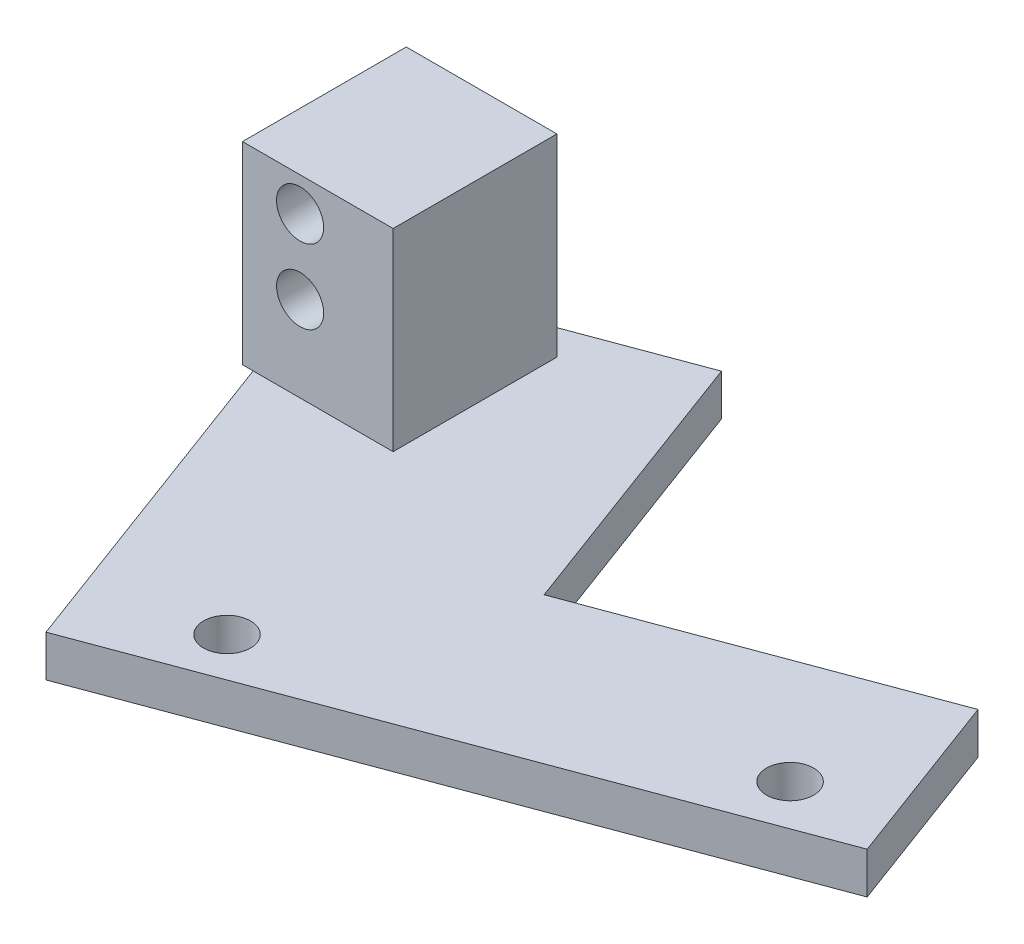
ISO-10303-21;
HEADER;
FILE_DESCRIPTION(('STEP AP214'),'2;1');
FILE_NAME('part.step','',(''),(''),'','','');
FILE_SCHEMA(('AUTOMOTIVE_DESIGN { 1 0 10303 214 1 1 1 1 }'));
ENDSEC;
DATA;
#1=APPLICATION_CONTEXT('core data for automotive mechanical design processes');
#2=APPLICATION_PROTOCOL_DEFINITION('international standard','automotive_design',2000,#1);
#3=PRODUCT_CONTEXT('',#1,'mechanical');
#4=PRODUCT('Part','Part','',(#3));
#5=PRODUCT_RELATED_PRODUCT_CATEGORY('part','',(#4));
#6=PRODUCT_DEFINITION_FORMATION('','',#4);
#7=PRODUCT_DEFINITION_CONTEXT('part definition',#1,'design');
#8=PRODUCT_DEFINITION('design','',#6,#7);
#9=PRODUCT_DEFINITION_SHAPE('','',#8);
#10=(LENGTH_UNIT() NAMED_UNIT(*) SI_UNIT(.MILLI.,.METRE.));
#11=(NAMED_UNIT(*) PLANE_ANGLE_UNIT() SI_UNIT($,.RADIAN.));
#12=(NAMED_UNIT(*) SI_UNIT($,.STERADIAN.) SOLID_ANGLE_UNIT());
#13=UNCERTAINTY_MEASURE_WITH_UNIT(LENGTH_MEASURE(1.E-05),#10,'distance_accuracy_value','');
#14=(GEOMETRIC_REPRESENTATION_CONTEXT(3) GLOBAL_UNCERTAINTY_ASSIGNED_CONTEXT((#13)) GLOBAL_UNIT_ASSIGNED_CONTEXT((#10,
#11,#12)) REPRESENTATION_CONTEXT('',''));
#15=CARTESIAN_POINT('',(0.,0.,0.));
#16=DIRECTION('',(0.,0.,1.));
#17=DIRECTION('',(1.,0.,0.));
#18=AXIS2_PLACEMENT_3D('',#15,#16,#17);
#19=CARTESIAN_POINT('',(-91.4998945327473,102.490000374125,55.16093843316));
#20=DIRECTION('',(0.,1.,0.));
#21=DIRECTION('',(-1.,0.,0.));
#22=AXIS2_PLACEMENT_3D('',#19,#20,#21);
#23=PLANE('',#22);
#24=DIRECTION('',(0.,0.,-1.));
#25=VECTOR('',#24,1.);
#26=CARTESIAN_POINT('',(-111.819894532747,102.490000374125,55.16093843316));
#27=LINE('',#26,#25);
#28=CARTESIAN_POINT('',(-111.819894532747,102.490000374125,22.0979999999999));
#29=VERTEX_POINT('',#28);
#30=CARTESIAN_POINT('',(-111.819894532747,102.490000374125,18.2301481765038));
#31=VERTEX_POINT('',#30);
#32=EDGE_CURVE('E98',#29,#31,#27,.T.);
#33=ORIENTED_EDGE('',*,*,#32,.T.);
#34=DIRECTION('',(0.348563605767916,0.,0.937285128834374));
#35=VECTOR('',#34,1.);
#36=CARTESIAN_POINT('',(-116.851792660847,102.490000374125,4.69940885882034));
#37=LINE('',#36,#35);
#38=CARTESIAN_POINT('',(-110.381492986944,102.490000374125,22.098));
#39=VERTEX_POINT('',#38);
#40=EDGE_CURVE('E11',#31,#39,#37,.T.);
#41=ORIENTED_EDGE('',*,*,#40,.T.);
#42=DIRECTION('',(-1.,0.,0.));
#43=VECTOR('',#42,1.);
#44=CARTESIAN_POINT('',(-91.4998945327473,102.490000374125,22.0979999999999));
#45=LINE('',#44,#43);
#46=EDGE_CURVE('E66',#39,#29,#45,.T.);
#47=ORIENTED_EDGE('',*,*,#46,.T.);
#48=EDGE_LOOP('',(#33,#41,#47));
#49=FACE_BOUND('',#48,.T.);
#50=ADVANCED_FACE('F39',(#49),#23,.F.);
#51=CARTESIAN_POINT('',(0.,0.,0.));
#52=DIRECTION('',(0.,0.,-1.));
#53=DIRECTION('',(-1.,0.,0.));
#54=AXIS2_PLACEMENT_3D('',#51,#52,#53);
#55=PLANE('',#54);
#56=CARTESIAN_POINT('',(-104.050470740245,123.999999999999,0.));
#57=DIRECTION('',(0.,0.,1.));
#58=DIRECTION('',(1.,0.,0.));
#59=AXIS2_PLACEMENT_3D('',#56,#57,#58);
#60=CIRCLE('',#59,3.17499999999998);
#61=CARTESIAN_POINT('',(-100.875470740245,123.999999999999,0.));
#62=VERTEX_POINT('',#61);
#63=EDGE_CURVE('E123',#62,#62,#60,.T.);
#64=ORIENTED_EDGE('',*,*,#63,.T.);
#65=EDGE_LOOP('',(#64));
#66=FACE_BOUND('',#65,.T.);
#67=DIRECTION('',(0.,-1.,0.));
#68=VECTOR('',#67,1.);
#69=CARTESIAN_POINT('',(-111.819894532747,102.490000374125,0.));
#70=LINE('',#69,#68);
#71=CARTESIAN_POINT('',(-111.819894532747,128.571708482202,0.));
#72=VERTEX_POINT('',#71);
#73=CARTESIAN_POINT('',(-111.819894532747,102.490000374125,0.));
#74=VERTEX_POINT('',#73);
#75=EDGE_CURVE('E105',#72,#74,#70,.T.);
#76=ORIENTED_EDGE('',*,*,#75,.F.);
#77=DIRECTION('',(-1.,0.,0.));
#78=VECTOR('',#77,1.);
#79=CARTESIAN_POINT('',(-111.819894532747,128.571708482202,0.));
#80=LINE('',#79,#78);
#81=CARTESIAN_POINT('',(-91.4998945327473,128.571708482202,0.));
#82=VERTEX_POINT('',#81);
#83=EDGE_CURVE('E135',#82,#72,#80,.T.);
#84=ORIENTED_EDGE('',*,*,#83,.F.);
#85=DIRECTION('',(0.,1.,0.));
#86=VECTOR('',#85,1.);
#87=CARTESIAN_POINT('',(-91.4998945327473,128.571708482202,0.));
#88=LINE('',#87,#86);
#89=CARTESIAN_POINT('',(-91.4998945327473,102.490000374125,0.));
#90=VERTEX_POINT('',#89);
#91=EDGE_CURVE('E133',#90,#82,#88,.T.);
#92=ORIENTED_EDGE('',*,*,#91,.F.);
#93=DIRECTION('',(1.,0.,0.));
#94=VECTOR('',#93,1.);
#95=CARTESIAN_POINT('',(-91.4998945327473,102.490000374125,0.));
#96=LINE('',#95,#94);
#97=CARTESIAN_POINT('',(-104.215114692185,102.490000374125,0.));
#98=VERTEX_POINT('',#97);
#99=EDGE_CURVE('E108',#98,#90,#96,.T.);
#100=ORIENTED_EDGE('',*,*,#99,.F.);
#101=EDGE_CURVE('E91',#74,#98,#96,.T.);
#102=ORIENTED_EDGE('',*,*,#101,.F.);
#103=EDGE_LOOP('',(#76,#84,#92,#100,#102));
#104=FACE_BOUND('',#103,.T.);
#105=CARTESIAN_POINT('',(-104.045206420171,113.999999999999,0.));
#106=DIRECTION('',(0.,0.,1.));
#107=DIRECTION('',(1.,0.,0.));
#108=AXIS2_PLACEMENT_3D('',#105,#106,#107);
#109=CIRCLE('',#108,3.17499999999995);
#110=CARTESIAN_POINT('',(-100.870206420171,113.999999999999,0.));
#111=VERTEX_POINT('',#110);
#112=EDGE_CURVE('E126',#111,#111,#109,.T.);
#113=ORIENTED_EDGE('',*,*,#112,.T.);
#114=EDGE_LOOP('',(#113));
#115=FACE_BOUND('',#114,.T.);
#116=ADVANCED_FACE('F102',(#66,#104,#115),#55,.T.);
#117=CARTESIAN_POINT('',(-111.819894532747,102.490000374125,55.16093843316));
#118=DIRECTION('',(1.,0.,0.));
#119=DIRECTION('',(0.,0.,-1.));
#120=AXIS2_PLACEMENT_3D('',#117,#118,#119);
#121=PLANE('',#120);
#122=ORIENTED_EDGE('',*,*,#32,.F.);
#123=DIRECTION('',(0.,1.,0.));
#124=VECTOR('',#123,1.);
#125=CARTESIAN_POINT('',(-111.819894532747,102.490000374125,22.0979999999999));
#126=LINE('',#125,#124);
#127=CARTESIAN_POINT('',(-111.819894532747,128.571708482202,22.0979999999999));
#128=VERTEX_POINT('',#127);
#129=EDGE_CURVE('E119',#29,#128,#126,.T.);
#130=ORIENTED_EDGE('',*,*,#129,.T.);
#131=DIRECTION('',(0.,0.,-1.));
#132=VECTOR('',#131,1.);
#133=CARTESIAN_POINT('',(-111.819894532747,128.571708482202,55.16093843316));
#134=LINE('',#133,#132);
#135=EDGE_CURVE('E115',#128,#72,#134,.T.);
#136=ORIENTED_EDGE('',*,*,#135,.T.);
#137=ORIENTED_EDGE('',*,*,#75,.T.);
#138=CARTESIAN_POINT('',(-111.819894532747,102.490000374125,2.82811430668283));
#139=VERTEX_POINT('',#138);
#140=EDGE_CURVE('E87',#139,#74,#27,.T.);
#141=ORIENTED_EDGE('',*,*,#140,.F.);
#142=EDGE_CURVE('E95',#31,#139,#27,.T.);
#143=ORIENTED_EDGE('',*,*,#142,.F.);
#144=EDGE_LOOP('',(#122,#130,#136,#137,#141,#143));
#145=FACE_BOUND('',#144,.T.);
#146=ADVANCED_FACE('F112',(#145),#121,.F.);
#147=ORIENTED_EDGE('',*,*,#101,.T.);
#148=DIRECTION('',(-0.937285128834374,0.,0.348563605767916));
#149=VECTOR('',#148,1.);
#150=CARTESIAN_POINT('',(-116.851792660847,102.490000374125,4.69940885882034));
#151=LINE('',#150,#149);
#152=EDGE_CURVE('E48',#98,#139,#151,.T.);
#153=ORIENTED_EDGE('',*,*,#152,.T.);
#154=ORIENTED_EDGE('',*,*,#140,.T.);
#155=EDGE_LOOP('',(#147,#153,#154));
#156=FACE_BOUND('',#155,.T.);
#157=ADVANCED_FACE('F89',(#156),#23,.F.);
#158=CARTESIAN_POINT('',(-91.4998945327473,128.571708482202,55.16093843316));
#159=DIRECTION('',(-1.,0.,0.));
#160=DIRECTION('',(0.,0.,1.));
#161=AXIS2_PLACEMENT_3D('',#158,#159,#160);
#162=PLANE('',#161);
#163=DIRECTION('',(0.,0.,-1.));
#164=VECTOR('',#163,1.);
#165=CARTESIAN_POINT('',(-91.4998945327473,128.571708482202,55.16093843316));
#166=LINE('',#165,#164);
#167=CARTESIAN_POINT('',(-91.4998945327473,128.571708482202,22.0979999999999));
#168=VERTEX_POINT('',#167);
#169=EDGE_CURVE('E134',#168,#82,#166,.T.);
#170=ORIENTED_EDGE('',*,*,#169,.F.);
#171=DIRECTION('',(0.,-1.,0.));
#172=VECTOR('',#171,1.);
#173=CARTESIAN_POINT('',(-91.4998945327473,128.571708482202,22.0979999999999));
#174=LINE('',#173,#172);
#175=CARTESIAN_POINT('',(-91.4998945327473,102.490000374125,22.0979999999999));
#176=VERTEX_POINT('',#175);
#177=EDGE_CURVE('E109',#168,#176,#174,.T.);
#178=ORIENTED_EDGE('',*,*,#177,.T.);
#179=DIRECTION('',(0.,0.,-1.));
#180=VECTOR('',#179,1.);
#181=CARTESIAN_POINT('',(-91.4998945327473,102.490000374125,55.16093843316));
#182=LINE('',#181,#180);
#183=EDGE_CURVE('E130',#176,#90,#182,.T.);
#184=ORIENTED_EDGE('',*,*,#183,.T.);
#185=ORIENTED_EDGE('',*,*,#91,.T.);
#186=EDGE_LOOP('',(#170,#178,#184,#185));
#187=FACE_BOUND('',#186,.T.);
#188=ADVANCED_FACE('F160',(#187),#162,.F.);
#189=CARTESIAN_POINT('',(-111.819894532747,128.571708482202,55.16093843316));
#190=DIRECTION('',(0.,-1.,0.));
#191=DIRECTION('',(0.,0.,-1.));
#192=AXIS2_PLACEMENT_3D('',#189,#190,#191);
#193=PLANE('',#192);
#194=ORIENTED_EDGE('',*,*,#135,.F.);
#195=DIRECTION('',(1.,0.,0.));
#196=VECTOR('',#195,1.);
#197=CARTESIAN_POINT('',(-111.819894532747,128.571708482202,22.0979999999999));
#198=LINE('',#197,#196);
#199=EDGE_CURVE('E136',#128,#168,#198,.T.);
#200=ORIENTED_EDGE('',*,*,#199,.T.);
#201=ORIENTED_EDGE('',*,*,#169,.T.);
#202=ORIENTED_EDGE('',*,*,#83,.T.);
#203=EDGE_LOOP('',(#194,#200,#201,#202));
#204=FACE_BOUND('',#203,.T.);
#205=ADVANCED_FACE('F318',(#204),#193,.F.);
#206=CARTESIAN_POINT('',(-104.050470740245,123.999999999999,55.16093843316));
#207=DIRECTION('',(0.,0.,-1.));
#208=DIRECTION('',(-1.,0.,0.));
#209=AXIS2_PLACEMENT_3D('',#206,#207,#208);
#210=CYLINDRICAL_SURFACE('',#209,3.17499999999998);
#211=CARTESIAN_POINT('',(-104.050470740245,123.999999999999,22.0979999999999));
#212=DIRECTION('',(0.,0.,-1.));
#213=DIRECTION('',(-1.,0.,0.));
#214=AXIS2_PLACEMENT_3D('',#211,#212,#213);
#215=CIRCLE('',#214,3.17499999999998);
#216=CARTESIAN_POINT('',(-107.225470740245,123.999999999999,22.0979999999999));
#217=VERTEX_POINT('',#216);
#218=EDGE_CURVE('E143',#217,#217,#215,.T.);
#219=ORIENTED_EDGE('',*,*,#218,.F.);
#220=EDGE_LOOP('',(#219));
#221=FACE_BOUND('',#220,.T.);
#222=ORIENTED_EDGE('',*,*,#63,.F.);
#223=EDGE_LOOP('',(#222));
#224=FACE_BOUND('',#223,.T.);
#225=ADVANCED_FACE('F322',(#221,#224),#210,.F.);
#226=CARTESIAN_POINT('',(-104.045206420171,113.999999999999,55.16093843316));
#227=DIRECTION('',(0.,0.,-1.));
#228=DIRECTION('',(-1.,0.,0.));
#229=AXIS2_PLACEMENT_3D('',#226,#227,#228);
#230=CYLINDRICAL_SURFACE('',#229,3.17499999999995);
#231=CARTESIAN_POINT('',(-104.045206420171,113.999999999999,22.0979999999999));
#232=DIRECTION('',(0.,0.,-1.));
#233=DIRECTION('',(-1.,0.,0.));
#234=AXIS2_PLACEMENT_3D('',#231,#232,#233);
#235=CIRCLE('',#234,3.17499999999995);
#236=CARTESIAN_POINT('',(-107.220206420171,113.999999999999,22.0979999999999));
#237=VERTEX_POINT('',#236);
#238=EDGE_CURVE('E43',#237,#237,#235,.T.);
#239=ORIENTED_EDGE('',*,*,#238,.F.);
#240=EDGE_LOOP('',(#239));
#241=FACE_BOUND('',#240,.T.);
#242=ORIENTED_EDGE('',*,*,#112,.F.);
#243=EDGE_LOOP('',(#242));
#244=FACE_BOUND('',#243,.T.);
#245=ADVANCED_FACE('F321',(#241,#244),#230,.F.);
#246=CARTESIAN_POINT('',(-135.790161013805,109.407487112952,22.0979999999999));
#247=DIRECTION('',(0.,0.,-1.));
#248=DIRECTION('',(-1.,0.,0.));
#249=AXIS2_PLACEMENT_3D('',#246,#247,#248);
#250=PLANE('',#249);
#251=ORIENTED_EDGE('',*,*,#238,.T.);
#252=EDGE_LOOP('',(#251));
#253=FACE_BOUND('',#252,.T.);
#254=ORIENTED_EDGE('',*,*,#218,.T.);
#255=EDGE_LOOP('',(#254));
#256=FACE_BOUND('',#255,.T.);
#257=EDGE_CURVE('E96',#176,#39,#45,.T.);
#258=ORIENTED_EDGE('',*,*,#257,.F.);
#259=ORIENTED_EDGE('',*,*,#177,.F.);
#260=ORIENTED_EDGE('',*,*,#199,.F.);
#261=ORIENTED_EDGE('',*,*,#129,.F.);
#262=ORIENTED_EDGE('',*,*,#46,.F.);
#263=EDGE_LOOP('',(#258,#259,#260,#261,#262));
#264=FACE_BOUND('',#263,.T.);
#265=ADVANCED_FACE('F41',(#253,#256,#264),#250,.F.);
#266=CARTESIAN_POINT('',(0.,102.490000374125,-1.55740159258012E-13));
#267=DIRECTION('',(0.,1.,0.));
#268=DIRECTION('',(0.,0.,1.));
#269=AXIS2_PLACEMENT_3D('',#266,#267,#268);
#270=PLANE('',#269);
#271=CARTESIAN_POINT('',(-116.851792660847,102.490000374125,4.69940885882034));
#272=VERTEX_POINT('',#271);
#273=EDGE_CURVE('E50',#272,#31,#37,.T.);
#274=ORIENTED_EDGE('',*,*,#273,.T.);
#275=ORIENTED_EDGE('',*,*,#142,.T.);
#276=EDGE_CURVE('E58',#139,#272,#151,.T.);
#277=ORIENTED_EDGE('',*,*,#276,.T.);
#278=EDGE_LOOP('',(#274,#275,#277));
#279=FACE_BOUND('',#278,.T.);
#280=ADVANCED_FACE('F294',(#279),#270,.T.);
#281=CARTESIAN_POINT('',(-116.851792660847,96.9020003741251,4.69940885882035));
#282=DIRECTION('',(-0.937285128834374,0.,0.348563605767916));
#283=DIRECTION('',(0.348563605767916,0.,0.937285128834374));
#284=AXIS2_PLACEMENT_3D('',#281,#282,#283);
#285=PLANE('',#284);
#286=ORIENTED_EDGE('',*,*,#273,.F.);
#287=DIRECTION('',(0.,1.,0.));
#288=VECTOR('',#287,1.);
#289=CARTESIAN_POINT('',(-116.851792660847,96.9020003741251,4.69940885882035));
#290=LINE('',#289,#288);
#291=CARTESIAN_POINT('',(-116.851792660847,96.9020003741251,4.69940885882035));
#292=VERTEX_POINT('',#291);
#293=EDGE_CURVE('E127',#292,#272,#290,.T.);
#294=ORIENTED_EDGE('',*,*,#293,.F.);
#295=DIRECTION('',(0.348563605767916,0.,0.937285128834374));
#296=VECTOR('',#295,1.);
#297=CARTESIAN_POINT('',(-116.851792660847,96.9020003741251,4.69940885882035));
#298=LINE('',#297,#296);
#299=CARTESIAN_POINT('',(-93.8326521359339,96.9020003741252,66.5977187670424));
#300=VERTEX_POINT('',#299);
#301=EDGE_CURVE('E226',#292,#300,#298,.T.);
#302=ORIENTED_EDGE('',*,*,#301,.T.);
#303=DIRECTION('',(0.,1.,0.));
#304=VECTOR('',#303,1.);
#305=CARTESIAN_POINT('',(-93.8326521359339,96.9020003741252,66.5977187670424));
#306=LINE('',#305,#304);
#307=CARTESIAN_POINT('',(-93.8326521359339,102.490000374125,66.5977187670424));
#308=VERTEX_POINT('',#307);
#309=EDGE_CURVE('E155',#300,#308,#306,.T.);
#310=ORIENTED_EDGE('',*,*,#309,.T.);
#311=EDGE_CURVE('E51',#39,#308,#37,.T.);
#312=ORIENTED_EDGE('',*,*,#311,.F.);
#313=ORIENTED_EDGE('',*,*,#40,.F.);
#314=EDGE_LOOP('',(#286,#294,#302,#310,#312,#313));
#315=FACE_BOUND('',#314,.T.);
#316=ADVANCED_FACE('F233',(#315),#285,.T.);
#317=CARTESIAN_POINT('',(-116.851792660847,96.9020003741251,4.69940885882035));
#318=DIRECTION('',(-0.348563605767916,0.,-0.937285128834374));
#319=DIRECTION('',(-0.937285128834374,0.,0.348563605767916));
#320=AXIS2_PLACEMENT_3D('',#317,#318,#319);
#321=PLANE('',#320);
#322=CARTESIAN_POINT('',(-78.7605250250181,102.490000374125,-9.46621607958777));
#323=VERTEX_POINT('',#322);
#324=EDGE_CURVE('E148',#323,#98,#151,.T.);
#325=ORIENTED_EDGE('',*,*,#324,.F.);
#326=DIRECTION('',(0.,1.,0.));
#327=VECTOR('',#326,1.);
#328=CARTESIAN_POINT('',(-78.7605250250181,96.9020003741251,-9.46621607958777));
#329=LINE('',#328,#327);
#330=CARTESIAN_POINT('',(-78.7605250250181,96.9020003741251,-9.46621607958777));
#331=VERTEX_POINT('',#330);
#332=EDGE_CURVE('E259',#331,#323,#329,.T.);
#333=ORIENTED_EDGE('',*,*,#332,.F.);
#334=DIRECTION('',(-0.937285128834374,0.,0.348563605767916));
#335=VECTOR('',#334,1.);
#336=CARTESIAN_POINT('',(-116.851792660847,96.9020003741251,4.69940885882035));
#337=LINE('',#336,#335);
#338=EDGE_CURVE('E220',#331,#292,#337,.T.);
#339=ORIENTED_EDGE('',*,*,#338,.T.);
#340=ORIENTED_EDGE('',*,*,#293,.T.);
#341=ORIENTED_EDGE('',*,*,#276,.F.);
#342=ORIENTED_EDGE('',*,*,#152,.F.);
#343=EDGE_LOOP('',(#325,#333,#339,#340,#341,#342));
#344=FACE_BOUND('',#343,.T.);
#345=ADVANCED_FACE('F340',(#344),#321,.T.);
#346=CARTESIAN_POINT('',(-78.7605250250181,96.9020003741251,-9.46621607958777));
#347=DIRECTION('',(0.937285128834374,0.,-0.348563605767916));
#348=DIRECTION('',(-0.348563605767916,0.,-0.937285128834374));
#349=AXIS2_PLACEMENT_3D('',#346,#347,#348);
#350=PLANE('',#349);
#351=DIRECTION('',(-0.348563605767916,0.,-0.937285128834374));
#352=VECTOR('',#351,1.);
#353=CARTESIAN_POINT('',(-78.7605250250181,102.490000374125,-9.46621607958777));
#354=LINE('',#353,#352);
#355=CARTESIAN_POINT('',(-64.59490008661,102.490000374125,28.6250515562412));
#356=VERTEX_POINT('',#355);
#357=EDGE_CURVE('E255',#356,#323,#354,.T.);
#358=ORIENTED_EDGE('',*,*,#357,.F.);
#359=DIRECTION('',(0.,1.,0.));
#360=VECTOR('',#359,1.);
#361=CARTESIAN_POINT('',(-64.59490008661,96.9020003741252,28.6250515562412));
#362=LINE('',#361,#360);
#363=CARTESIAN_POINT('',(-64.59490008661,96.9020003741252,28.6250515562412));
#364=VERTEX_POINT('',#363);
#365=EDGE_CURVE('E261',#364,#356,#362,.T.);
#366=ORIENTED_EDGE('',*,*,#365,.F.);
#367=DIRECTION('',(-0.348563605767916,0.,-0.937285128834374));
#368=VECTOR('',#367,1.);
#369=CARTESIAN_POINT('',(-78.7605250250181,96.9020003741251,-9.46621607958777));
#370=LINE('',#369,#368);
#371=EDGE_CURVE('E243',#364,#331,#370,.T.);
#372=ORIENTED_EDGE('',*,*,#371,.T.);
#373=ORIENTED_EDGE('',*,*,#332,.T.);
#374=EDGE_LOOP('',(#358,#366,#372,#373));
#375=FACE_BOUND('',#374,.T.);
#376=ADVANCED_FACE('F348',(#375),#350,.T.);
#377=CARTESIAN_POINT('',(-64.59490008661,96.9020003741252,28.6250515562412));
#378=DIRECTION('',(-0.348563605767916,0.,-0.937285128834374));
#379=DIRECTION('',(-0.937285128834374,0.,0.348563605767916));
#380=AXIS2_PLACEMENT_3D('',#377,#378,#379);
#381=PLANE('',#380);
#382=DIRECTION('',(-0.937285128834374,0.,0.348563605767916));
#383=VECTOR('',#382,1.);
#384=CARTESIAN_POINT('',(-64.59490008661,102.490000374125,28.6250515562412));
#385=LINE('',#384,#383);
#386=CARTESIAN_POINT('',(-21.925888481416,102.490000374125,12.7570258273408));
#387=VERTEX_POINT('',#386);
#388=EDGE_CURVE('E252',#387,#356,#385,.T.);
#389=ORIENTED_EDGE('',*,*,#388,.F.);
#390=DIRECTION('',(0.,1.,0.));
#391=VECTOR('',#390,1.);
#392=CARTESIAN_POINT('',(-21.925888481416,96.9020003741252,12.7570258273408));
#393=LINE('',#392,#391);
#394=CARTESIAN_POINT('',(-21.925888481416,96.9020003741252,12.7570258273408));
#395=VERTEX_POINT('',#394);
#396=EDGE_CURVE('E263',#395,#387,#393,.T.);
#397=ORIENTED_EDGE('',*,*,#396,.F.);
#398=DIRECTION('',(-0.937285128834374,0.,0.348563605767916));
#399=VECTOR('',#398,1.);
#400=CARTESIAN_POINT('',(-64.59490008661,96.9020003741252,28.6250515562412));
#401=LINE('',#400,#399);
#402=EDGE_CURVE('E240',#395,#364,#401,.T.);
#403=ORIENTED_EDGE('',*,*,#402,.T.);
#404=ORIENTED_EDGE('',*,*,#365,.T.);
#405=EDGE_LOOP('',(#389,#397,#403,#404));
#406=FACE_BOUND('',#405,.T.);
#407=ADVANCED_FACE('F345',(#406),#381,.T.);
#408=CARTESIAN_POINT('',(-21.925888481416,96.9020003741252,12.7570258273408));
#409=DIRECTION('',(0.937285128834374,0.,-0.348563605767916));
#410=DIRECTION('',(-0.348563605767916,0.,-0.937285128834374));
#411=AXIS2_PLACEMENT_3D('',#408,#409,#410);
#412=PLANE('',#411);
#413=DIRECTION('',(-0.348563605767916,0.,-0.937285128834374));
#414=VECTOR('',#413,1.);
#415=CARTESIAN_POINT('',(-21.925888481416,102.490000374125,12.7570258273408));
#416=LINE('',#415,#414);
#417=CARTESIAN_POINT('',(-13.072372894911,102.490000374125,36.5640680997339));
#418=VERTEX_POINT('',#417);
#419=EDGE_CURVE('E249',#418,#387,#416,.T.);
#420=ORIENTED_EDGE('',*,*,#419,.F.);
#421=DIRECTION('',(0.,1.,0.));
#422=VECTOR('',#421,1.);
#423=CARTESIAN_POINT('',(-13.072372894911,96.9020003741252,36.5640680997339));
#424=LINE('',#423,#422);
#425=CARTESIAN_POINT('',(-13.072372894911,96.9020003741252,36.5640680997339));
#426=VERTEX_POINT('',#425);
#427=EDGE_CURVE('E219',#426,#418,#424,.T.);
#428=ORIENTED_EDGE('',*,*,#427,.F.);
#429=DIRECTION('',(-0.348563605767916,0.,-0.937285128834374));
#430=VECTOR('',#429,1.);
#431=CARTESIAN_POINT('',(-21.925888481416,96.9020003741252,12.7570258273408));
#432=LINE('',#431,#430);
#433=EDGE_CURVE('E230',#426,#395,#432,.T.);
#434=ORIENTED_EDGE('',*,*,#433,.T.);
#435=ORIENTED_EDGE('',*,*,#396,.T.);
#436=EDGE_LOOP('',(#420,#428,#434,#435));
#437=FACE_BOUND('',#436,.T.);
#438=ADVANCED_FACE('F266',(#437),#412,.T.);
#439=CARTESIAN_POINT('',(-93.8326521359339,96.9020003741252,66.5977187670424));
#440=DIRECTION('',(0.348563605767916,0.,0.937285128834374));
#441=DIRECTION('',(0.937285128834374,0.,-0.348563605767916));
#442=AXIS2_PLACEMENT_3D('',#439,#440,#441);
#443=PLANE('',#442);
#444=DIRECTION('',(0.937285128834374,0.,-0.348563605767916));
#445=VECTOR('',#444,1.);
#446=CARTESIAN_POINT('',(-93.8326521359339,102.490000374125,66.5977187670424));
#447=LINE('',#446,#445);
#448=EDGE_CURVE('E215',#308,#418,#447,.T.);
#449=ORIENTED_EDGE('',*,*,#448,.F.);
#450=ORIENTED_EDGE('',*,*,#309,.F.);
#451=DIRECTION('',(0.937285128834374,0.,-0.348563605767916));
#452=VECTOR('',#451,1.);
#453=CARTESIAN_POINT('',(-93.8326521359339,96.9020003741252,66.5977187670424));
#454=LINE('',#453,#452);
#455=EDGE_CURVE('E213',#300,#426,#454,.T.);
#456=ORIENTED_EDGE('',*,*,#455,.T.);
#457=ORIENTED_EDGE('',*,*,#427,.T.);
#458=EDGE_LOOP('',(#449,#450,#456,#457));
#459=FACE_BOUND('',#458,.T.);
#460=ADVANCED_FACE('F212',(#459),#443,.T.);
#461=CARTESIAN_POINT('',(0.,96.9020003741252,-1.46895811759662E-13));
#462=DIRECTION('',(0.,1.,0.));
#463=DIRECTION('',(0.,0.,1.));
#464=AXIS2_PLACEMENT_3D('',#461,#462,#463);
#465=PLANE('',#464);
#466=CARTESIAN_POINT('',(-26.1725046743068,96.9020003741252,33.8627353548147));
#467=DIRECTION('',(0.,1.,0.));
#468=DIRECTION('',(0.,0.,1.));
#469=AXIS2_PLACEMENT_3D('',#466,#467,#468);
#470=CIRCLE('',#469,3.175);
#471=CARTESIAN_POINT('',(-26.1725046743068,96.9020003741252,37.0377353548147));
#472=VERTEX_POINT('',#471);
#473=EDGE_CURVE('E275',#472,#472,#470,.T.);
#474=ORIENTED_EDGE('',*,*,#473,.T.);
#475=EDGE_LOOP('',(#474));
#476=FACE_BOUND('',#475,.T.);
#477=CARTESIAN_POINT('',(-81.3473263414442,96.9020003741252,54.659995842569));
#478=DIRECTION('',(0.,1.,0.));
#479=DIRECTION('',(0.,0.,1.));
#480=AXIS2_PLACEMENT_3D('',#477,#478,#479);
#481=CIRCLE('',#480,3.175);
#482=CARTESIAN_POINT('',(-81.3473263414442,96.9020003741252,57.834995842569));
#483=VERTEX_POINT('',#482);
#484=EDGE_CURVE('E270',#483,#483,#481,.T.);
#485=ORIENTED_EDGE('',*,*,#484,.T.);
#486=EDGE_LOOP('',(#485));
#487=FACE_BOUND('',#486,.T.);
#488=ORIENTED_EDGE('',*,*,#301,.F.);
#489=ORIENTED_EDGE('',*,*,#338,.F.);
#490=ORIENTED_EDGE('',*,*,#371,.F.);
#491=ORIENTED_EDGE('',*,*,#402,.F.);
#492=ORIENTED_EDGE('',*,*,#433,.F.);
#493=ORIENTED_EDGE('',*,*,#455,.F.);
#494=EDGE_LOOP('',(#488,#489,#490,#491,#492,#493));
#495=FACE_BOUND('',#494,.T.);
#496=ADVANCED_FACE('F224',(#476,#487,#495),#465,.F.);
#497=CARTESIAN_POINT('',(-26.1725046743068,102.490000374125,33.8627353548147));
#498=DIRECTION('',(0.,1.,0.));
#499=DIRECTION('',(0.,0.,1.));
#500=AXIS2_PLACEMENT_3D('',#497,#498,#499);
#501=CIRCLE('',#500,3.175);
#502=CARTESIAN_POINT('',(-26.1725046743068,102.490000374125,37.0377353548147));
#503=VERTEX_POINT('',#502);
#504=EDGE_CURVE('E277',#503,#503,#501,.T.);
#505=ORIENTED_EDGE('',*,*,#504,.F.);
#506=EDGE_LOOP('',(#505));
#507=FACE_BOUND('',#506,.T.);
#508=CARTESIAN_POINT('',(-81.3473263414442,102.490000374125,54.659995842569));
#509=DIRECTION('',(0.,1.,0.));
#510=DIRECTION('',(0.,0.,1.));
#511=AXIS2_PLACEMENT_3D('',#508,#509,#510);
#512=CIRCLE('',#511,3.175);
#513=CARTESIAN_POINT('',(-81.3473263414442,102.490000374125,57.834995842569));
#514=VERTEX_POINT('',#513);
#515=EDGE_CURVE('E236',#514,#514,#512,.T.);
#516=ORIENTED_EDGE('',*,*,#515,.F.);
#517=EDGE_LOOP('',(#516));
#518=FACE_BOUND('',#517,.T.);
#519=ORIENTED_EDGE('',*,*,#183,.F.);
#520=ORIENTED_EDGE('',*,*,#257,.T.);
#521=ORIENTED_EDGE('',*,*,#311,.T.);
#522=ORIENTED_EDGE('',*,*,#448,.T.);
#523=ORIENTED_EDGE('',*,*,#419,.T.);
#524=ORIENTED_EDGE('',*,*,#388,.T.);
#525=ORIENTED_EDGE('',*,*,#357,.T.);
#526=ORIENTED_EDGE('',*,*,#324,.T.);
#527=ORIENTED_EDGE('',*,*,#99,.T.);
#528=EDGE_LOOP('',(#519,#520,#521,#522,#523,#524,#525,#526,#527));
#529=FACE_BOUND('',#528,.T.);
#530=ADVANCED_FACE('F268',(#507,#518,#529),#270,.T.);
#531=CARTESIAN_POINT('',(-81.3473263414442,96.9020003741252,54.659995842569));
#532=DIRECTION('',(0.,1.,0.));
#533=DIRECTION('',(0.,0.,1.));
#534=AXIS2_PLACEMENT_3D('',#531,#532,#533);
#535=CYLINDRICAL_SURFACE('',#534,3.175);
#536=ORIENTED_EDGE('',*,*,#484,.F.);
#537=EDGE_LOOP('',(#536));
#538=FACE_BOUND('',#537,.T.);
#539=ORIENTED_EDGE('',*,*,#515,.T.);
#540=EDGE_LOOP('',(#539));
#541=FACE_BOUND('',#540,.T.);
#542=ADVANCED_FACE('F287',(#538,#541),#535,.F.);
#543=CARTESIAN_POINT('',(-26.1725046743068,96.9020003741252,33.8627353548147));
#544=DIRECTION('',(0.,1.,0.));
#545=DIRECTION('',(0.,0.,1.));
#546=AXIS2_PLACEMENT_3D('',#543,#544,#545);
#547=CYLINDRICAL_SURFACE('',#546,3.175);
#548=ORIENTED_EDGE('',*,*,#473,.F.);
#549=EDGE_LOOP('',(#548));
#550=FACE_BOUND('',#549,.T.);
#551=ORIENTED_EDGE('',*,*,#504,.T.);
#552=EDGE_LOOP('',(#551));
#553=FACE_BOUND('',#552,.T.);
#554=ADVANCED_FACE('F284',(#550,#553),#547,.F.);
#555=CLOSED_SHELL('',(#50,#116,#146,#157,#188,#205,#225,#245,#265,#280,#316,#345,#376,#407,#438,
#460,#496,#530,#542,#554));
#556=MANIFOLD_SOLID_BREP('B2',#555);
#557=ADVANCED_BREP_SHAPE_REPRESENTATION('',(#18,#556),#14);
#558=SHAPE_DEFINITION_REPRESENTATION(#9,#557);
ENDSEC;
END-ISO-10303-21;
